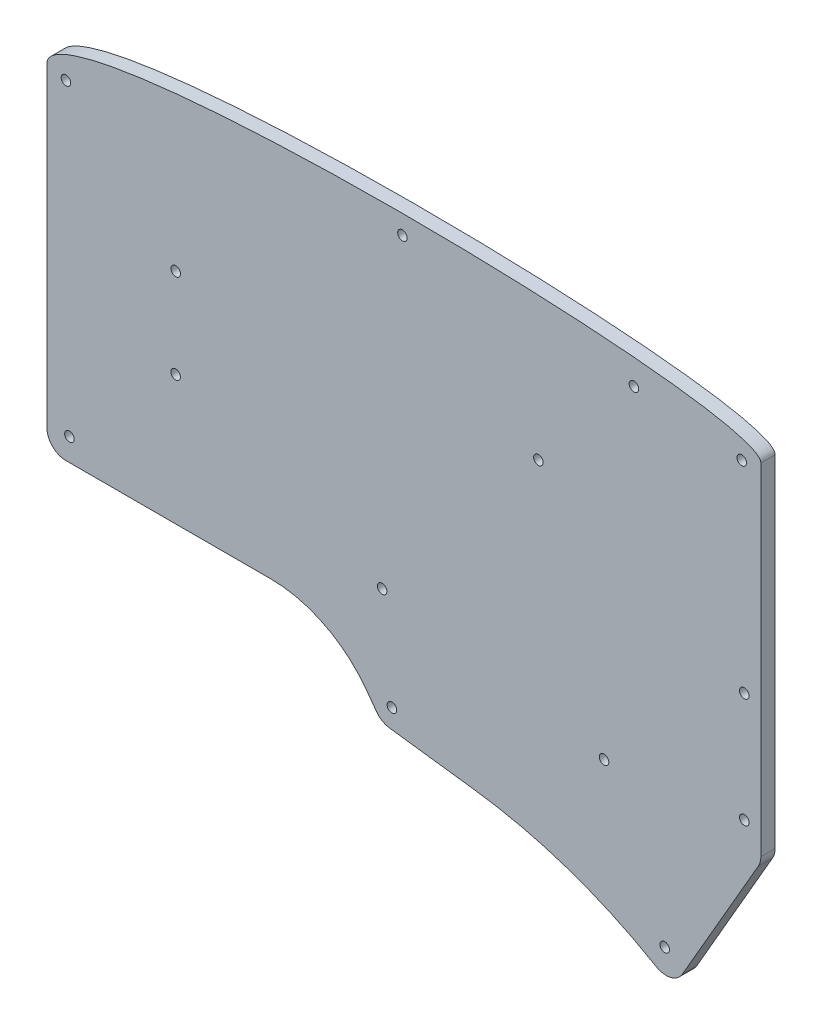
ISO-10303-21;
HEADER;
FILE_DESCRIPTION(('STEP AP214'),'2;1');
FILE_NAME('part.step','',(''),(''),'','','');
FILE_SCHEMA(('AUTOMOTIVE_DESIGN { 1 0 10303 214 1 1 1 1 }'));
ENDSEC;
DATA;
#1=APPLICATION_CONTEXT('core data for automotive mechanical design processes');
#2=APPLICATION_PROTOCOL_DEFINITION('international standard','automotive_design',2000,#1);
#3=PRODUCT_CONTEXT('',#1,'mechanical');
#4=PRODUCT('Part','Part','',(#3));
#5=PRODUCT_RELATED_PRODUCT_CATEGORY('part','',(#4));
#6=PRODUCT_DEFINITION_FORMATION('','',#4);
#7=PRODUCT_DEFINITION_CONTEXT('part definition',#1,'design');
#8=PRODUCT_DEFINITION('design','',#6,#7);
#9=PRODUCT_DEFINITION_SHAPE('','',#8);
#10=(LENGTH_UNIT() NAMED_UNIT(*) SI_UNIT(.MILLI.,.METRE.));
#11=(NAMED_UNIT(*) PLANE_ANGLE_UNIT() SI_UNIT($,.RADIAN.));
#12=(NAMED_UNIT(*) SI_UNIT($,.STERADIAN.) SOLID_ANGLE_UNIT());
#13=UNCERTAINTY_MEASURE_WITH_UNIT(LENGTH_MEASURE(1.E-05),#10,'distance_accuracy_value','');
#14=(GEOMETRIC_REPRESENTATION_CONTEXT(3) GLOBAL_UNCERTAINTY_ASSIGNED_CONTEXT((#13)) GLOBAL_UNIT_ASSIGNED_CONTEXT((#10,
#11,#12)) REPRESENTATION_CONTEXT('',''));
#15=CARTESIAN_POINT('',(0.,0.,0.));
#16=DIRECTION('',(0.,0.,1.));
#17=DIRECTION('',(1.,0.,0.));
#18=AXIS2_PLACEMENT_3D('',#15,#16,#17);
#19=CARTESIAN_POINT('',(-5.60340836480404,96.4255615904271,3.));
#20=CARTESIAN_POINT('',(-5.60340836480403,103.460733083272,3.));
#21=CARTESIAN_POINT('',(68.6271572793247,109.640132520942,3.));
#22=CARTESIAN_POINT('',(143.989385395709,103.45856741741,3.));
#23=CARTESIAN_POINT('',(143.989385395703,98.7904693493434,3.));
#24=B_SPLINE_CURVE_WITH_KNOTS('',3,(#19,#20,#21,#22,#23),.UNSPECIFIED.,.F.,.F.,(4,1,4),(0.,
0.499912398993814,1.),.UNSPECIFIED.);
#25=DIRECTION('',(0.,0.,-1.));
#26=VECTOR('',#25,1.);
#27=SURFACE_OF_LINEAR_EXTRUSION('',#24,#26);
#28=CARTESIAN_POINT('',(-5.60340836480404,96.4255615904271,0.));
#29=CARTESIAN_POINT('',(-5.60340836480403,103.460733083272,0.));
#30=CARTESIAN_POINT('',(68.6271572793247,109.640132520942,0.));
#31=CARTESIAN_POINT('',(143.989385395709,103.45856741741,0.));
#32=CARTESIAN_POINT('',(143.989385395703,98.7904693493434,0.));
#33=B_SPLINE_CURVE_WITH_KNOTS('',3,(#28,#29,#30,#31,#32),.UNSPECIFIED.,.F.,.F.,(4,1,4),(0.,
0.499912398993814,1.),.UNSPECIFIED.);
#34=CARTESIAN_POINT('',(-5.60340836480404,96.4255615904271,0.));
#35=VERTEX_POINT('',#34);
#36=CARTESIAN_POINT('',(143.989385395703,98.7904693493434,0.));
#37=VERTEX_POINT('',#36);
#38=EDGE_CURVE('E208',#35,#37,#33,.T.);
#39=ORIENTED_EDGE('',*,*,#38,.F.);
#40=DIRECTION('',(0.,0.,-1.));
#41=VECTOR('',#40,1.);
#42=CARTESIAN_POINT('',(-5.60340836480404,96.4255615904271,3.));
#43=LINE('',#42,#41);
#44=CARTESIAN_POINT('',(-5.60340836480404,96.4255615904271,3.));
#45=VERTEX_POINT('',#44);
#46=EDGE_CURVE('E11',#45,#35,#43,.T.);
#47=ORIENTED_EDGE('',*,*,#46,.F.);
#48=CARTESIAN_POINT('',(143.989385395703,98.7904693493434,3.));
#49=VERTEX_POINT('',#48);
#50=EDGE_CURVE('E293',#45,#49,#24,.T.);
#51=ORIENTED_EDGE('',*,*,#50,.T.);
#52=DIRECTION('',(0.,0.,-1.));
#53=VECTOR('',#52,1.);
#54=CARTESIAN_POINT('',(143.989385395703,98.7904693493434,3.));
#55=LINE('',#54,#53);
#56=EDGE_CURVE('E104',#49,#37,#55,.T.);
#57=ORIENTED_EDGE('',*,*,#56,.T.);
#58=EDGE_LOOP('',(#39,#47,#51,#57));
#59=FACE_BOUND('',#58,.T.);
#60=ADVANCED_FACE('F35',(#59),#27,.T.);
#61=CARTESIAN_POINT('',(-5.60340836480404,0.,3.));
#62=DIRECTION('',(1.,0.,0.));
#63=DIRECTION('',(0.,1.,0.));
#64=AXIS2_PLACEMENT_3D('',#61,#62,#63);
#65=PLANE('',#64);
#66=DIRECTION('',(0.,-1.,0.));
#67=VECTOR('',#66,1.);
#68=CARTESIAN_POINT('',(-5.60340836480404,0.,0.));
#69=LINE('',#68,#67);
#70=CARTESIAN_POINT('',(-5.60340836480404,30.4255688575379,0.));
#71=VERTEX_POINT('',#70);
#72=EDGE_CURVE('E213',#35,#71,#69,.T.);
#73=ORIENTED_EDGE('',*,*,#72,.T.);
#74=DIRECTION('',(0.,0.,-1.));
#75=VECTOR('',#74,1.);
#76=CARTESIAN_POINT('',(-5.60340836480404,30.4255688575379,3.));
#77=LINE('',#76,#75);
#78=CARTESIAN_POINT('',(-5.60340836480404,30.4255688575379,3.));
#79=VERTEX_POINT('',#78);
#80=EDGE_CURVE('E44',#79,#71,#77,.T.);
#81=ORIENTED_EDGE('',*,*,#80,.F.);
#82=DIRECTION('',(0.,-1.,0.));
#83=VECTOR('',#82,1.);
#84=CARTESIAN_POINT('',(-5.60340836480404,0.,3.));
#85=LINE('',#84,#83);
#86=EDGE_CURVE('E337',#45,#79,#85,.T.);
#87=ORIENTED_EDGE('',*,*,#86,.F.);
#88=ORIENTED_EDGE('',*,*,#46,.T.);
#89=EDGE_LOOP('',(#73,#81,#87,#88));
#90=FACE_BOUND('',#89,.T.);
#91=ADVANCED_FACE('F321',(#90),#65,.F.);
#92=CARTESIAN_POINT('',(-1.60340836480404,30.4255688575379,3.));
#93=DIRECTION('',(0.,0.,-1.));
#94=DIRECTION('',(-1.,0.,0.));
#95=AXIS2_PLACEMENT_3D('',#92,#93,#94);
#96=CYLINDRICAL_SURFACE('',#95,4.);
#97=CARTESIAN_POINT('',(-1.60340836480404,30.4255688575379,0.));
#98=DIRECTION('',(0.,0.,1.));
#99=DIRECTION('',(1.,0.,0.));
#100=AXIS2_PLACEMENT_3D('',#97,#98,#99);
#101=CIRCLE('',#100,4.);
#102=CARTESIAN_POINT('',(-1.60340836480401,26.4255688575379,0.));
#103=VERTEX_POINT('',#102);
#104=EDGE_CURVE('E219',#103,#71,#101,.F.);
#105=ORIENTED_EDGE('',*,*,#104,.F.);
#106=DIRECTION('',(0.,0.,-1.));
#107=VECTOR('',#106,1.);
#108=CARTESIAN_POINT('',(-1.60340836480401,26.4255688575379,3.));
#109=LINE('',#108,#107);
#110=CARTESIAN_POINT('',(-1.60340836480401,26.4255688575379,3.));
#111=VERTEX_POINT('',#110);
#112=EDGE_CURVE('E311',#111,#103,#109,.T.);
#113=ORIENTED_EDGE('',*,*,#112,.F.);
#114=CARTESIAN_POINT('',(-1.60340836480404,30.4255688575379,3.));
#115=DIRECTION('',(0.,0.,1.));
#116=DIRECTION('',(1.,0.,0.));
#117=AXIS2_PLACEMENT_3D('',#114,#115,#116);
#118=CIRCLE('',#117,4.);
#119=EDGE_CURVE('E318',#111,#79,#118,.F.);
#120=ORIENTED_EDGE('',*,*,#119,.T.);
#121=ORIENTED_EDGE('',*,*,#80,.T.);
#122=EDGE_LOOP('',(#105,#113,#120,#121));
#123=FACE_BOUND('',#122,.T.);
#124=ADVANCED_FACE('F316',(#123),#96,.T.);
#125=CARTESIAN_POINT('',(0.,26.4255688575379,3.));
#126=DIRECTION('',(0.,1.,0.));
#127=DIRECTION('',(0.,0.,1.));
#128=AXIS2_PLACEMENT_3D('',#125,#126,#127);
#129=PLANE('',#128);
#130=DIRECTION('',(1.,0.,0.));
#131=VECTOR('',#130,1.);
#132=CARTESIAN_POINT('',(0.,26.4255688575379,0.));
#133=LINE('',#132,#131);
#134=CARTESIAN_POINT('',(41.2672141804128,26.4255688575379,0.));
#135=VERTEX_POINT('',#134);
#136=EDGE_CURVE('E222',#103,#135,#133,.T.);
#137=ORIENTED_EDGE('',*,*,#136,.T.);
#138=DIRECTION('',(0.,0.,-1.));
#139=VECTOR('',#138,1.);
#140=CARTESIAN_POINT('',(41.2672141804128,26.4255688575379,3.));
#141=LINE('',#140,#139);
#142=CARTESIAN_POINT('',(41.2672141804128,26.4255688575379,3.));
#143=VERTEX_POINT('',#142);
#144=EDGE_CURVE('E309',#143,#135,#141,.T.);
#145=ORIENTED_EDGE('',*,*,#144,.F.);
#146=DIRECTION('',(1.,0.,0.));
#147=VECTOR('',#146,1.);
#148=CARTESIAN_POINT('',(0.,26.4255688575379,3.));
#149=LINE('',#148,#147);
#150=EDGE_CURVE('E333',#111,#143,#149,.T.);
#151=ORIENTED_EDGE('',*,*,#150,.F.);
#152=ORIENTED_EDGE('',*,*,#112,.T.);
#153=EDGE_LOOP('',(#137,#145,#151,#152));
#154=FACE_BOUND('',#153,.T.);
#155=ADVANCED_FACE('F330',(#154),#129,.F.);
#156=CARTESIAN_POINT('',(41.2672141804129,1.42556885753786,3.));
#157=DIRECTION('',(0.,0.,-1.));
#158=DIRECTION('',(-1.,0.,0.));
#159=AXIS2_PLACEMENT_3D('',#156,#157,#158);
#160=CYLINDRICAL_SURFACE('',#159,25.);
#161=CARTESIAN_POINT('',(41.2672141804129,1.42556885753786,0.));
#162=DIRECTION('',(0.,0.,1.));
#163=DIRECTION('',(1.,0.,0.));
#164=AXIS2_PLACEMENT_3D('',#161,#162,#163);
#165=CIRCLE('',#164,25.);
#166=CARTESIAN_POINT('',(61.4664169198252,16.156224263599,0.));
#167=VERTEX_POINT('',#166);
#168=EDGE_CURVE('E225',#167,#135,#165,.T.);
#169=ORIENTED_EDGE('',*,*,#168,.F.);
#170=DIRECTION('',(0.,0.,-1.));
#171=VECTOR('',#170,1.);
#172=CARTESIAN_POINT('',(61.4664169198252,16.156224263599,3.));
#173=LINE('',#172,#171);
#174=CARTESIAN_POINT('',(61.4664169198252,16.156224263599,3.));
#175=VERTEX_POINT('',#174);
#176=EDGE_CURVE('E307',#175,#167,#173,.T.);
#177=ORIENTED_EDGE('',*,*,#176,.F.);
#178=CARTESIAN_POINT('',(41.2672141804129,1.42556885753786,3.));
#179=DIRECTION('',(0.,0.,1.));
#180=DIRECTION('',(1.,0.,0.));
#181=AXIS2_PLACEMENT_3D('',#178,#179,#180);
#182=CIRCLE('',#181,25.);
#183=EDGE_CURVE('E335',#175,#143,#182,.T.);
#184=ORIENTED_EDGE('',*,*,#183,.T.);
#185=ORIENTED_EDGE('',*,*,#144,.T.);
#186=EDGE_LOOP('',(#169,#177,#184,#185));
#187=FACE_BOUND('',#186,.T.);
#188=ADVANCED_FACE('F376',(#187),#160,.F.);
#189=CARTESIAN_POINT('',(47.8176337053878,34.871925072218,3.));
#190=DIRECTION('',(0.807968109576491,0.589226216242448,0.));
#191=DIRECTION('',(-0.589226216242448,0.807968109576491,0.));
#192=AXIS2_PLACEMENT_3D('',#189,#190,#191);
#193=PLANE('',#192);
#194=DIRECTION('',(0.589226216242448,-0.807968109576491,0.));
#195=VECTOR('',#194,1.);
#196=CARTESIAN_POINT('',(47.8176337053878,34.871925072218,0.));
#197=LINE('',#196,#195);
#198=CARTESIAN_POINT('',(63.4651141754063,13.4155389398775,0.));
#199=VERTEX_POINT('',#198);
#200=EDGE_CURVE('E228',#167,#199,#197,.T.);
#201=ORIENTED_EDGE('',*,*,#200,.T.);
#202=DIRECTION('',(0.,0.,-1.));
#203=VECTOR('',#202,1.);
#204=CARTESIAN_POINT('',(63.4651141754063,13.4155389398775,3.));
#205=LINE('',#204,#203);
#206=CARTESIAN_POINT('',(63.4651141754063,13.4155389398775,3.));
#207=VERTEX_POINT('',#206);
#208=EDGE_CURVE('E305',#207,#199,#205,.T.);
#209=ORIENTED_EDGE('',*,*,#208,.F.);
#210=DIRECTION('',(0.589226216242448,-0.807968109576491,0.));
#211=VECTOR('',#210,1.);
#212=CARTESIAN_POINT('',(47.8176337053878,34.871925072218,3.));
#213=LINE('',#212,#211);
#214=EDGE_CURVE('E342',#175,#207,#213,.T.);
#215=ORIENTED_EDGE('',*,*,#214,.F.);
#216=ORIENTED_EDGE('',*,*,#176,.T.);
#217=EDGE_LOOP('',(#201,#209,#215,#216));
#218=FACE_BOUND('',#217,.T.);
#219=ADVANCED_FACE('F379',(#218),#193,.F.);
#220=CARTESIAN_POINT('',(66.6969866137123,15.7724438048473,3.));
#221=DIRECTION('',(0.,0.,-1.));
#222=DIRECTION('',(-1.,0.,0.));
#223=AXIS2_PLACEMENT_3D('',#220,#221,#222);
#224=CYLINDRICAL_SURFACE('',#223,4.);
#225=CARTESIAN_POINT('',(66.6969866137123,15.7724438048473,0.));
#226=DIRECTION('',(0.,0.,1.));
#227=DIRECTION('',(1.,0.,0.));
#228=AXIS2_PLACEMENT_3D('',#225,#226,#227);
#229=CIRCLE('',#228,4.);
#230=CARTESIAN_POINT('',(66.1810041743476,11.8058631461102,0.));
#231=VERTEX_POINT('',#230);
#232=EDGE_CURVE('E231',#231,#199,#229,.F.);
#233=ORIENTED_EDGE('',*,*,#232,.F.);
#234=DIRECTION('',(0.,0.,-1.));
#235=VECTOR('',#234,1.);
#236=CARTESIAN_POINT('',(66.1810041743476,11.8058631461102,3.));
#237=LINE('',#236,#235);
#238=CARTESIAN_POINT('',(66.1810041743476,11.8058631461102,3.));
#239=VERTEX_POINT('',#238);
#240=EDGE_CURVE('E303',#239,#231,#237,.T.);
#241=ORIENTED_EDGE('',*,*,#240,.F.);
#242=CARTESIAN_POINT('',(66.6969866137123,15.7724438048473,3.));
#243=DIRECTION('',(0.,0.,1.));
#244=DIRECTION('',(1.,0.,0.));
#245=AXIS2_PLACEMENT_3D('',#242,#243,#244);
#246=CIRCLE('',#245,4.);
#247=EDGE_CURVE('E344',#239,#207,#246,.F.);
#248=ORIENTED_EDGE('',*,*,#247,.T.);
#249=ORIENTED_EDGE('',*,*,#208,.T.);
#250=EDGE_LOOP('',(#233,#241,#248,#249));
#251=FACE_BOUND('',#250,.T.);
#252=ADVANCED_FACE('F383',(#251),#224,.T.);
#253=CARTESIAN_POINT('',(2.61142403089936,20.07514842071,3.));
#254=DIRECTION('',(0.128995609841179,0.991645164684275,0.));
#255=DIRECTION('',(-0.991645164684275,0.128995609841179,0.));
#256=AXIS2_PLACEMENT_3D('',#253,#254,#255);
#257=PLANE('',#256);
#258=DIRECTION('',(0.991645164684275,-0.128995609841179,0.));
#259=VECTOR('',#258,1.);
#260=CARTESIAN_POINT('',(2.61142403089936,20.07514842071,0.));
#261=LINE('',#260,#259);
#262=CARTESIAN_POINT('',(84.1879397351147,9.46347726378552,0.));
#263=VERTEX_POINT('',#262);
#264=EDGE_CURVE('E234',#231,#263,#261,.T.);
#265=ORIENTED_EDGE('',*,*,#264,.T.);
#266=DIRECTION('',(0.,0.,-1.));
#267=VECTOR('',#266,1.);
#268=CARTESIAN_POINT('',(84.1879397351147,9.46347726378552,3.));
#269=LINE('',#268,#267);
#270=CARTESIAN_POINT('',(84.1879397351147,9.46347726378552,3.));
#271=VERTEX_POINT('',#270);
#272=EDGE_CURVE('E301',#271,#263,#269,.T.);
#273=ORIENTED_EDGE('',*,*,#272,.F.);
#274=DIRECTION('',(0.991645164684275,-0.128995609841179,0.));
#275=VECTOR('',#274,1.);
#276=CARTESIAN_POINT('',(2.61142403089936,20.07514842071,3.));
#277=LINE('',#276,#275);
#278=EDGE_CURVE('E347',#239,#271,#277,.T.);
#279=ORIENTED_EDGE('',*,*,#278,.F.);
#280=ORIENTED_EDGE('',*,*,#240,.T.);
#281=EDGE_LOOP('',(#265,#273,#279,#280));
#282=FACE_BOUND('',#281,.T.);
#283=ADVANCED_FACE('F387',(#282),#257,.F.);
#284=CARTESIAN_POINT('',(71.2883787509972,-89.701039204642,3.));
#285=DIRECTION('',(0.,0.,-1.));
#286=DIRECTION('',(-1.,0.,0.));
#287=AXIS2_PLACEMENT_3D('',#284,#285,#286);
#288=CYLINDRICAL_SURFACE('',#287,100.);
#289=CARTESIAN_POINT('',(71.2883787509972,-89.701039204642,0.));
#290=DIRECTION('',(0.,0.,1.));
#291=DIRECTION('',(1.,0.,0.));
#292=AXIS2_PLACEMENT_3D('',#289,#290,#291);
#293=CIRCLE('',#292,100.);
#294=CARTESIAN_POINT('',(121.325879514695,-3.12016073068008,0.));
#295=VERTEX_POINT('',#294);
#296=EDGE_CURVE('E237',#295,#263,#293,.T.);
#297=ORIENTED_EDGE('',*,*,#296,.F.);
#298=DIRECTION('',(0.,0.,-1.));
#299=VECTOR('',#298,1.);
#300=CARTESIAN_POINT('',(121.325879514695,-3.12016073068008,3.));
#301=LINE('',#300,#299);
#302=CARTESIAN_POINT('',(121.325879514695,-3.12016073068008,3.));
#303=VERTEX_POINT('',#302);
#304=EDGE_CURVE('E299',#303,#295,#301,.T.);
#305=ORIENTED_EDGE('',*,*,#304,.F.);
#306=CARTESIAN_POINT('',(71.2883787509972,-89.701039204642,3.));
#307=DIRECTION('',(0.,0.,1.));
#308=DIRECTION('',(1.,0.,0.));
#309=AXIS2_PLACEMENT_3D('',#306,#307,#308);
#310=CIRCLE('',#309,100.);
#311=EDGE_CURVE('E349',#303,#271,#310,.T.);
#312=ORIENTED_EDGE('',*,*,#311,.T.);
#313=ORIENTED_EDGE('',*,*,#272,.T.);
#314=EDGE_LOOP('',(#297,#305,#312,#313));
#315=FACE_BOUND('',#314,.T.);
#316=ADVANCED_FACE('F391',(#315),#288,.F.);
#317=CARTESIAN_POINT('',(29.0252407178952,50.2229488067635,3.));
#318=DIRECTION('',(0.500375007636977,0.865808784739619,0.));
#319=DIRECTION('',(-0.865808784739619,0.500375007636977,0.));
#320=AXIS2_PLACEMENT_3D('',#317,#318,#319);
#321=PLANE('',#320);
#322=DIRECTION('',(0.865808784739619,-0.500375007636977,0.));
#323=VECTOR('',#322,1.);
#324=CARTESIAN_POINT('',(29.0252407178952,50.2229488067635,0.));
#325=LINE('',#324,#323);
#326=CARTESIAN_POINT('',(122.126093986319,-3.58262695810535,0.));
#327=VERTEX_POINT('',#326);
#328=EDGE_CURVE('E240',#295,#327,#325,.T.);
#329=ORIENTED_EDGE('',*,*,#328,.T.);
#330=DIRECTION('',(0.,0.,-1.));
#331=VECTOR('',#330,1.);
#332=CARTESIAN_POINT('',(122.126093986319,-3.58262695810535,3.));
#333=LINE('',#332,#331);
#334=CARTESIAN_POINT('',(122.126093986319,-3.58262695810535,3.));
#335=VERTEX_POINT('',#334);
#336=EDGE_CURVE('E297',#335,#327,#333,.T.);
#337=ORIENTED_EDGE('',*,*,#336,.F.);
#338=DIRECTION('',(0.865808784739619,-0.500375007636977,0.));
#339=VECTOR('',#338,1.);
#340=CARTESIAN_POINT('',(29.0252407178952,50.2229488067635,3.));
#341=LINE('',#340,#339);
#342=EDGE_CURVE('E352',#303,#335,#341,.T.);
#343=ORIENTED_EDGE('',*,*,#342,.F.);
#344=ORIENTED_EDGE('',*,*,#304,.T.);
#345=EDGE_LOOP('',(#329,#337,#343,#344));
#346=FACE_BOUND('',#345,.T.);
#347=ADVANCED_FACE('F395',(#346),#321,.F.);
#348=CARTESIAN_POINT('',(124.127594016867,-0.119391819146861,3.));
#349=DIRECTION('',(0.,0.,-1.));
#350=DIRECTION('',(-1.,0.,0.));
#351=AXIS2_PLACEMENT_3D('',#348,#349,#350);
#352=CYLINDRICAL_SURFACE('',#351,3.99999999999999);
#353=CARTESIAN_POINT('',(124.127594016867,-0.119391819146861,0.));
#354=DIRECTION('',(0.,0.,1.));
#355=DIRECTION('',(1.,0.,0.));
#356=AXIS2_PLACEMENT_3D('',#353,#354,#355);
#357=CIRCLE('',#356,3.99999999999999);
#358=CARTESIAN_POINT('',(127.591695632005,-2.11939181914664,0.));
#359=VERTEX_POINT('',#358);
#360=EDGE_CURVE('E243',#359,#327,#357,.F.);
#361=ORIENTED_EDGE('',*,*,#360,.F.);
#362=DIRECTION('',(0.,0.,-1.));
#363=VECTOR('',#362,1.);
#364=CARTESIAN_POINT('',(127.591695632005,-2.11939181914664,3.));
#365=LINE('',#364,#363);
#366=CARTESIAN_POINT('',(127.591695632005,-2.11939181914664,3.));
#367=VERTEX_POINT('',#366);
#368=EDGE_CURVE('E159',#367,#359,#365,.T.);
#369=ORIENTED_EDGE('',*,*,#368,.F.);
#370=CARTESIAN_POINT('',(124.127594016867,-0.119391819146861,3.));
#371=DIRECTION('',(0.,0.,1.));
#372=DIRECTION('',(1.,0.,0.));
#373=AXIS2_PLACEMENT_3D('',#370,#371,#372);
#374=CIRCLE('',#373,3.99999999999999);
#375=EDGE_CURVE('E148',#367,#335,#374,.F.);
#376=ORIENTED_EDGE('',*,*,#375,.T.);
#377=ORIENTED_EDGE('',*,*,#336,.T.);
#378=EDGE_LOOP('',(#361,#369,#376,#377));
#379=FACE_BOUND('',#378,.T.);
#380=ADVANCED_FACE('F355',(#379),#352,.T.);
#381=CARTESIAN_POINT('',(96.6114953019872,-55.7786728194067,3.));
#382=DIRECTION('',(-0.866025403784469,0.499999999999947,0.));
#383=DIRECTION('',(-0.499999999999947,-0.86602540378447,0.));
#384=AXIS2_PLACEMENT_3D('',#381,#382,#383);
#385=PLANE('',#384);
#386=DIRECTION('',(0.499999999999947,0.866025403784469,0.));
#387=VECTOR('',#386,1.);
#388=CARTESIAN_POINT('',(96.6114953019872,-55.7786728194067,0.));
#389=LINE('',#388,#387);
#390=CARTESIAN_POINT('',(143.453487010841,25.35403674806,0.));
#391=VERTEX_POINT('',#390);
#392=EDGE_CURVE('E155',#359,#391,#389,.T.);
#393=ORIENTED_EDGE('',*,*,#392,.T.);
#394=DIRECTION('',(0.,0.,-1.));
#395=VECTOR('',#394,1.);
#396=CARTESIAN_POINT('',(143.453487010841,25.35403674806,3.));
#397=LINE('',#396,#395);
#398=CARTESIAN_POINT('',(143.453487010841,25.35403674806,3.));
#399=VERTEX_POINT('',#398);
#400=EDGE_CURVE('E152',#399,#391,#397,.T.);
#401=ORIENTED_EDGE('',*,*,#400,.F.);
#402=DIRECTION('',(0.499999999999947,0.866025403784469,0.));
#403=VECTOR('',#402,1.);
#404=CARTESIAN_POINT('',(96.6114953019872,-55.7786728194067,3.));
#405=LINE('',#404,#403);
#406=EDGE_CURVE('E141',#367,#399,#405,.T.);
#407=ORIENTED_EDGE('',*,*,#406,.F.);
#408=ORIENTED_EDGE('',*,*,#368,.T.);
#409=EDGE_LOOP('',(#393,#401,#407,#408));
#410=FACE_BOUND('',#409,.T.);
#411=ADVANCED_FACE('F153',(#410),#385,.F.);
#412=CARTESIAN_POINT('',(139.989385395703,27.3540367480598,3.));
#413=DIRECTION('',(0.,0.,-1.));
#414=DIRECTION('',(-1.,0.,0.));
#415=AXIS2_PLACEMENT_3D('',#412,#413,#414);
#416=CYLINDRICAL_SURFACE('',#415,4.);
#417=CARTESIAN_POINT('',(139.989385395703,27.3540367480598,0.));
#418=DIRECTION('',(0.,0.,1.));
#419=DIRECTION('',(1.,0.,0.));
#420=AXIS2_PLACEMENT_3D('',#417,#418,#419);
#421=CIRCLE('',#420,4.);
#422=CARTESIAN_POINT('',(143.989385395703,27.3540367480598,0.));
#423=VERTEX_POINT('',#422);
#424=EDGE_CURVE('E247',#423,#391,#421,.F.);
#425=ORIENTED_EDGE('',*,*,#424,.F.);
#426=DIRECTION('',(0.,0.,-1.));
#427=VECTOR('',#426,1.);
#428=CARTESIAN_POINT('',(143.989385395703,27.3540367480598,3.));
#429=LINE('',#428,#427);
#430=CARTESIAN_POINT('',(143.989385395703,27.3540367480598,3.));
#431=VERTEX_POINT('',#430);
#432=EDGE_CURVE('E97',#431,#423,#429,.T.);
#433=ORIENTED_EDGE('',*,*,#432,.F.);
#434=CARTESIAN_POINT('',(139.989385395703,27.3540367480598,3.));
#435=DIRECTION('',(0.,0.,1.));
#436=DIRECTION('',(1.,0.,0.));
#437=AXIS2_PLACEMENT_3D('',#434,#435,#436);
#438=CIRCLE('',#437,4.);
#439=EDGE_CURVE('E146',#431,#399,#438,.F.);
#440=ORIENTED_EDGE('',*,*,#439,.T.);
#441=ORIENTED_EDGE('',*,*,#400,.T.);
#442=EDGE_LOOP('',(#425,#433,#440,#441));
#443=FACE_BOUND('',#442,.T.);
#444=ADVANCED_FACE('F161',(#443),#416,.T.);
#445=CARTESIAN_POINT('',(21.3877982759689,53.5502350908751,3.));
#446=DIRECTION('',(0.,0.,-1.));
#447=DIRECTION('',(-1.,0.,0.));
#448=AXIS2_PLACEMENT_3D('',#445,#446,#447);
#449=CYLINDRICAL_SURFACE('',#448,1.);
#450=CARTESIAN_POINT('',(21.3877982759689,53.5502350908751,3.));
#451=DIRECTION('',(0.,0.,1.));
#452=DIRECTION('',(1.,0.,0.));
#453=AXIS2_PLACEMENT_3D('',#450,#451,#452);
#454=CIRCLE('',#453,1.);
#455=CARTESIAN_POINT('',(22.3877982759689,53.5502350908751,3.));
#456=VERTEX_POINT('',#455);
#457=EDGE_CURVE('E202',#456,#456,#454,.T.);
#458=ORIENTED_EDGE('',*,*,#457,.T.);
#459=EDGE_LOOP('',(#458));
#460=FACE_BOUND('',#459,.T.);
#461=CARTESIAN_POINT('',(21.3877982759689,53.5502350908751,0.));
#462=DIRECTION('',(0.,0.,1.));
#463=DIRECTION('',(1.,0.,0.));
#464=AXIS2_PLACEMENT_3D('',#461,#462,#463);
#465=CIRCLE('',#464,1.);
#466=CARTESIAN_POINT('',(22.3877982759689,53.5502350908751,0.));
#467=VERTEX_POINT('',#466);
#468=EDGE_CURVE('E287',#467,#467,#465,.T.);
#469=ORIENTED_EDGE('',*,*,#468,.F.);
#470=EDGE_LOOP('',(#469));
#471=FACE_BOUND('',#470,.T.);
#472=ADVANCED_FACE('F406',(#460,#471),#449,.F.);
#473=CARTESIAN_POINT('',(64.6378635328406,36.3000901732402,3.));
#474=DIRECTION('',(0.,0.,-1.));
#475=DIRECTION('',(-1.,0.,0.));
#476=AXIS2_PLACEMENT_3D('',#473,#474,#475);
#477=CYLINDRICAL_SURFACE('',#476,0.999999999999998);
#478=CARTESIAN_POINT('',(64.6378635328406,36.3000901732402,3.));
#479=DIRECTION('',(0.,0.,1.));
#480=DIRECTION('',(1.,0.,0.));
#481=AXIS2_PLACEMENT_3D('',#478,#479,#480);
#482=CIRCLE('',#481,0.999999999999998);
#483=CARTESIAN_POINT('',(65.6378635328406,36.3000901732402,3.));
#484=VERTEX_POINT('',#483);
#485=EDGE_CURVE('E199',#484,#484,#482,.T.);
#486=ORIENTED_EDGE('',*,*,#485,.T.);
#487=EDGE_LOOP('',(#486));
#488=FACE_BOUND('',#487,.T.);
#489=CARTESIAN_POINT('',(64.6378635328406,36.3000901732402,0.));
#490=DIRECTION('',(0.,0.,1.));
#491=DIRECTION('',(1.,0.,0.));
#492=AXIS2_PLACEMENT_3D('',#489,#490,#491);
#493=CIRCLE('',#492,0.999999999999998);
#494=CARTESIAN_POINT('',(65.6378635328406,36.3000901732402,0.));
#495=VERTEX_POINT('',#494);
#496=EDGE_CURVE('E284',#495,#495,#493,.T.);
#497=ORIENTED_EDGE('',*,*,#496,.F.);
#498=EDGE_LOOP('',(#497));
#499=FACE_BOUND('',#498,.T.);
#500=ADVANCED_FACE('F453',(#488,#499),#477,.F.);
#501=CARTESIAN_POINT('',(111.137845658361,28.5500518112157,3.));
#502=DIRECTION('',(0.,0.,-1.));
#503=DIRECTION('',(-1.,0.,0.));
#504=AXIS2_PLACEMENT_3D('',#501,#502,#503);
#505=CYLINDRICAL_SURFACE('',#504,0.999999999999998);
#506=CARTESIAN_POINT('',(111.137845658361,28.5500518112157,3.));
#507=DIRECTION('',(0.,0.,1.));
#508=DIRECTION('',(1.,0.,0.));
#509=AXIS2_PLACEMENT_3D('',#506,#507,#508);
#510=CIRCLE('',#509,0.999999999999998);
#511=CARTESIAN_POINT('',(112.137845658361,28.5500518112157,3.));
#512=VERTEX_POINT('',#511);
#513=EDGE_CURVE('E196',#512,#512,#510,.T.);
#514=ORIENTED_EDGE('',*,*,#513,.T.);
#515=EDGE_LOOP('',(#514));
#516=FACE_BOUND('',#515,.T.);
#517=CARTESIAN_POINT('',(111.137845658361,28.5500518112157,0.));
#518=DIRECTION('',(0.,0.,1.));
#519=DIRECTION('',(1.,0.,0.));
#520=AXIS2_PLACEMENT_3D('',#517,#518,#519);
#521=CIRCLE('',#520,0.999999999999998);
#522=CARTESIAN_POINT('',(112.137845658361,28.5500518112157,0.));
#523=VERTEX_POINT('',#522);
#524=EDGE_CURVE('E281',#523,#523,#521,.T.);
#525=ORIENTED_EDGE('',*,*,#524,.F.);
#526=EDGE_LOOP('',(#525));
#527=FACE_BOUND('',#526,.T.);
#528=ADVANCED_FACE('F449',(#516,#527),#505,.F.);
#529=CARTESIAN_POINT('',(97.3878272060292,76.0500388866752,3.));
#530=DIRECTION('',(0.,0.,-1.));
#531=DIRECTION('',(-1.,0.,0.));
#532=AXIS2_PLACEMENT_3D('',#529,#530,#531);
#533=CYLINDRICAL_SURFACE('',#532,0.999999999999998);
#534=CARTESIAN_POINT('',(97.3878272060292,76.0500388866752,3.));
#535=DIRECTION('',(0.,0.,1.));
#536=DIRECTION('',(1.,0.,0.));
#537=AXIS2_PLACEMENT_3D('',#534,#535,#536);
#538=CIRCLE('',#537,0.999999999999998);
#539=CARTESIAN_POINT('',(98.3878272060292,76.0500388866752,3.));
#540=VERTEX_POINT('',#539);
#541=EDGE_CURVE('E193',#540,#540,#538,.T.);
#542=ORIENTED_EDGE('',*,*,#541,.T.);
#543=EDGE_LOOP('',(#542));
#544=FACE_BOUND('',#543,.T.);
#545=CARTESIAN_POINT('',(97.3878272060292,76.0500388866752,0.));
#546=DIRECTION('',(0.,0.,1.));
#547=DIRECTION('',(1.,0.,0.));
#548=AXIS2_PLACEMENT_3D('',#545,#546,#547);
#549=CIRCLE('',#548,0.999999999999998);
#550=CARTESIAN_POINT('',(98.3878272060292,76.0500388866752,0.));
#551=VERTEX_POINT('',#550);
#552=EDGE_CURVE('E278',#551,#551,#549,.T.);
#553=ORIENTED_EDGE('',*,*,#552,.F.);
#554=EDGE_LOOP('',(#553));
#555=FACE_BOUND('',#554,.T.);
#556=ADVANCED_FACE('F445',(#544,#555),#533,.F.);
#557=CARTESIAN_POINT('',(140.524945013007,32.2810664530872,3.));
#558=DIRECTION('',(0.,0.,-1.));
#559=DIRECTION('',(-1.,0.,0.));
#560=AXIS2_PLACEMENT_3D('',#557,#558,#559);
#561=CYLINDRICAL_SURFACE('',#560,0.999999999999998);
#562=CARTESIAN_POINT('',(140.524945013007,32.2810664530872,3.));
#563=DIRECTION('',(0.,0.,1.));
#564=DIRECTION('',(1.,0.,0.));
#565=AXIS2_PLACEMENT_3D('',#562,#563,#564);
#566=CIRCLE('',#565,0.999999999999998);
#567=CARTESIAN_POINT('',(141.524945013007,32.2810664530872,3.));
#568=VERTEX_POINT('',#567);
#569=EDGE_CURVE('E190',#568,#568,#566,.T.);
#570=ORIENTED_EDGE('',*,*,#569,.T.);
#571=EDGE_LOOP('',(#570));
#572=FACE_BOUND('',#571,.T.);
#573=CARTESIAN_POINT('',(140.524945013007,32.2810664530872,0.));
#574=DIRECTION('',(0.,0.,1.));
#575=DIRECTION('',(1.,0.,0.));
#576=AXIS2_PLACEMENT_3D('',#573,#574,#575);
#577=CIRCLE('',#576,0.999999999999998);
#578=CARTESIAN_POINT('',(141.524945013007,32.2810664530872,0.));
#579=VERTEX_POINT('',#578);
#580=EDGE_CURVE('E275',#579,#579,#577,.T.);
#581=ORIENTED_EDGE('',*,*,#580,.F.);
#582=EDGE_LOOP('',(#581));
#583=FACE_BOUND('',#582,.T.);
#584=ADVANCED_FACE('F441',(#572,#583),#561,.F.);
#585=CARTESIAN_POINT('',(123.859596668122,0.881654910350953,3.));
#586=DIRECTION('',(0.,0.,-1.));
#587=DIRECTION('',(-1.,0.,0.));
#588=AXIS2_PLACEMENT_3D('',#585,#586,#587);
#589=CYLINDRICAL_SURFACE('',#588,0.999999999999998);
#590=CARTESIAN_POINT('',(123.859596668122,0.881654910350953,3.));
#591=DIRECTION('',(0.,0.,1.));
#592=DIRECTION('',(1.,0.,0.));
#593=AXIS2_PLACEMENT_3D('',#590,#591,#592);
#594=CIRCLE('',#593,0.999999999999998);
#595=CARTESIAN_POINT('',(124.859596668122,0.881654910350953,3.));
#596=VERTEX_POINT('',#595);
#597=EDGE_CURVE('E187',#596,#596,#594,.T.);
#598=ORIENTED_EDGE('',*,*,#597,.T.);
#599=EDGE_LOOP('',(#598));
#600=FACE_BOUND('',#599,.T.);
#601=CARTESIAN_POINT('',(123.859596668122,0.881654910350953,0.));
#602=DIRECTION('',(0.,0.,1.));
#603=DIRECTION('',(1.,0.,0.));
#604=AXIS2_PLACEMENT_3D('',#601,#602,#603);
#605=CIRCLE('',#604,0.999999999999998);
#606=CARTESIAN_POINT('',(124.859596668122,0.881654910350953,0.));
#607=VERTEX_POINT('',#606);
#608=EDGE_CURVE('E272',#607,#607,#605,.T.);
#609=ORIENTED_EDGE('',*,*,#608,.F.);
#610=EDGE_LOOP('',(#609));
#611=FACE_BOUND('',#610,.T.);
#612=ADVANCED_FACE('F437',(#600,#611),#589,.F.);
#613=CARTESIAN_POINT('',(66.6969866137123,15.7724438048473,3.));
#614=DIRECTION('',(0.,0.,-1.));
#615=DIRECTION('',(-1.,0.,0.));
#616=AXIS2_PLACEMENT_3D('',#613,#614,#615);
#617=CYLINDRICAL_SURFACE('',#616,0.999999999999998);
#618=CARTESIAN_POINT('',(66.6969866137123,15.7724438048473,3.));
#619=DIRECTION('',(0.,0.,1.));
#620=DIRECTION('',(1.,0.,0.));
#621=AXIS2_PLACEMENT_3D('',#618,#619,#620);
#622=CIRCLE('',#621,0.999999999999998);
#623=CARTESIAN_POINT('',(67.6969866137123,15.7724438048473,3.));
#624=VERTEX_POINT('',#623);
#625=EDGE_CURVE('E184',#624,#624,#622,.T.);
#626=ORIENTED_EDGE('',*,*,#625,.T.);
#627=EDGE_LOOP('',(#626));
#628=FACE_BOUND('',#627,.T.);
#629=CARTESIAN_POINT('',(66.6969866137123,15.7724438048473,0.));
#630=DIRECTION('',(0.,0.,1.));
#631=DIRECTION('',(1.,0.,0.));
#632=AXIS2_PLACEMENT_3D('',#629,#630,#631);
#633=CIRCLE('',#632,0.999999999999998);
#634=CARTESIAN_POINT('',(67.6969866137123,15.7724438048473,0.));
#635=VERTEX_POINT('',#634);
#636=EDGE_CURVE('E269',#635,#635,#633,.T.);
#637=ORIENTED_EDGE('',*,*,#636,.F.);
#638=EDGE_LOOP('',(#637));
#639=FACE_BOUND('',#638,.T.);
#640=ADVANCED_FACE('F433',(#628,#639),#617,.F.);
#641=CARTESIAN_POINT('',(-0.871175317770399,31.1578019045715,3.));
#642=DIRECTION('',(0.,0.,-1.));
#643=DIRECTION('',(-1.,0.,0.));
#644=AXIS2_PLACEMENT_3D('',#641,#642,#643);
#645=CYLINDRICAL_SURFACE('',#644,1.);
#646=CARTESIAN_POINT('',(-0.871175317770399,31.1578019045715,3.));
#647=DIRECTION('',(0.,0.,1.));
#648=DIRECTION('',(1.,0.,0.));
#649=AXIS2_PLACEMENT_3D('',#646,#647,#648);
#650=CIRCLE('',#649,1.);
#651=CARTESIAN_POINT('',(0.128824682229601,31.1578019045715,3.));
#652=VERTEX_POINT('',#651);
#653=EDGE_CURVE('E181',#652,#652,#650,.T.);
#654=ORIENTED_EDGE('',*,*,#653,.T.);
#655=EDGE_LOOP('',(#654));
#656=FACE_BOUND('',#655,.T.);
#657=CARTESIAN_POINT('',(-0.871175317770399,31.1578019045715,0.));
#658=DIRECTION('',(0.,0.,1.));
#659=DIRECTION('',(1.,0.,0.));
#660=AXIS2_PLACEMENT_3D('',#657,#658,#659);
#661=CIRCLE('',#660,1.);
#662=CARTESIAN_POINT('',(0.128824682229601,31.1578019045715,0.));
#663=VERTEX_POINT('',#662);
#664=EDGE_CURVE('E266',#663,#663,#661,.T.);
#665=ORIENTED_EDGE('',*,*,#664,.F.);
#666=EDGE_LOOP('',(#665));
#667=FACE_BOUND('',#666,.T.);
#668=ADVANCED_FACE('F429',(#656,#667),#645,.F.);
#669=CARTESIAN_POINT('',(-1.60340836480404,95.4255615904271,3.));
#670=DIRECTION('',(0.,0.,-1.));
#671=DIRECTION('',(-1.,0.,0.));
#672=AXIS2_PLACEMENT_3D('',#669,#670,#671);
#673=CYLINDRICAL_SURFACE('',#672,1.);
#674=CARTESIAN_POINT('',(-1.60340836480404,95.4255615904271,3.));
#675=DIRECTION('',(0.,0.,1.));
#676=DIRECTION('',(1.,0.,0.));
#677=AXIS2_PLACEMENT_3D('',#674,#675,#676);
#678=CIRCLE('',#677,1.);
#679=CARTESIAN_POINT('',(-0.603408364804036,95.4255615904271,3.));
#680=VERTEX_POINT('',#679);
#681=EDGE_CURVE('E178',#680,#680,#678,.T.);
#682=ORIENTED_EDGE('',*,*,#681,.T.);
#683=EDGE_LOOP('',(#682));
#684=FACE_BOUND('',#683,.T.);
#685=CARTESIAN_POINT('',(-1.60340836480404,95.4255615904271,0.));
#686=DIRECTION('',(0.,0.,1.));
#687=DIRECTION('',(1.,0.,0.));
#688=AXIS2_PLACEMENT_3D('',#685,#686,#687);
#689=CIRCLE('',#688,1.);
#690=CARTESIAN_POINT('',(-0.603408364804036,95.4255615904271,0.));
#691=VERTEX_POINT('',#690);
#692=EDGE_CURVE('E263',#691,#691,#689,.T.);
#693=ORIENTED_EDGE('',*,*,#692,.F.);
#694=EDGE_LOOP('',(#693));
#695=FACE_BOUND('',#694,.T.);
#696=ADVANCED_FACE('F425',(#684,#695),#673,.F.);
#697=CARTESIAN_POINT('',(68.8969684268213,102.549891480499,3.));
#698=DIRECTION('',(0.,0.,-1.));
#699=DIRECTION('',(-1.,0.,0.));
#700=AXIS2_PLACEMENT_3D('',#697,#698,#699);
#701=CYLINDRICAL_SURFACE('',#700,0.999999999999998);
#702=CARTESIAN_POINT('',(68.8969684268213,102.549891480499,3.));
#703=DIRECTION('',(0.,0.,1.));
#704=DIRECTION('',(1.,0.,0.));
#705=AXIS2_PLACEMENT_3D('',#702,#703,#704);
#706=CIRCLE('',#705,0.999999999999998);
#707=CARTESIAN_POINT('',(69.8969684268213,102.549891480499,3.));
#708=VERTEX_POINT('',#707);
#709=EDGE_CURVE('E175',#708,#708,#706,.T.);
#710=ORIENTED_EDGE('',*,*,#709,.T.);
#711=EDGE_LOOP('',(#710));
#712=FACE_BOUND('',#711,.T.);
#713=CARTESIAN_POINT('',(68.8969684268213,102.549891480499,0.));
#714=DIRECTION('',(0.,0.,1.));
#715=DIRECTION('',(1.,0.,0.));
#716=AXIS2_PLACEMENT_3D('',#713,#714,#715);
#717=CIRCLE('',#716,0.999999999999998);
#718=CARTESIAN_POINT('',(69.8969684268213,102.549891480499,0.));
#719=VERTEX_POINT('',#718);
#720=EDGE_CURVE('E260',#719,#719,#717,.T.);
#721=ORIENTED_EDGE('',*,*,#720,.F.);
#722=EDGE_LOOP('',(#721));
#723=FACE_BOUND('',#722,.T.);
#724=ADVANCED_FACE('F421',(#712,#723),#701,.F.);
#725=CARTESIAN_POINT('',(117.399952062791,99.3904693493434,3.));
#726=DIRECTION('',(0.,0.,-1.));
#727=DIRECTION('',(-1.,0.,0.));
#728=AXIS2_PLACEMENT_3D('',#725,#726,#727);
#729=CYLINDRICAL_SURFACE('',#728,0.999999999999998);
#730=CARTESIAN_POINT('',(117.399952062791,99.3904693493434,3.));
#731=DIRECTION('',(0.,0.,1.));
#732=DIRECTION('',(1.,0.,0.));
#733=AXIS2_PLACEMENT_3D('',#730,#731,#732);
#734=CIRCLE('',#733,0.999999999999998);
#735=CARTESIAN_POINT('',(118.399952062791,99.3904693493434,3.));
#736=VERTEX_POINT('',#735);
#737=EDGE_CURVE('E172',#736,#736,#734,.T.);
#738=ORIENTED_EDGE('',*,*,#737,.T.);
#739=EDGE_LOOP('',(#738));
#740=FACE_BOUND('',#739,.T.);
#741=CARTESIAN_POINT('',(117.399952062791,99.3904693493434,0.));
#742=DIRECTION('',(0.,0.,1.));
#743=DIRECTION('',(1.,0.,0.));
#744=AXIS2_PLACEMENT_3D('',#741,#742,#743);
#745=CIRCLE('',#744,0.999999999999998);
#746=CARTESIAN_POINT('',(118.399952062791,99.3904693493434,0.));
#747=VERTEX_POINT('',#746);
#748=EDGE_CURVE('E257',#747,#747,#745,.T.);
#749=ORIENTED_EDGE('',*,*,#748,.F.);
#750=EDGE_LOOP('',(#749));
#751=FACE_BOUND('',#750,.T.);
#752=ADVANCED_FACE('F417',(#740,#751),#729,.F.);
#753=CARTESIAN_POINT('',(139.989385395703,97.2904693493434,3.));
#754=DIRECTION('',(0.,0.,-1.));
#755=DIRECTION('',(-1.,0.,0.));
#756=AXIS2_PLACEMENT_3D('',#753,#754,#755);
#757=CYLINDRICAL_SURFACE('',#756,0.999999999999998);
#758=CARTESIAN_POINT('',(139.989385395703,97.2904693493434,3.));
#759=DIRECTION('',(0.,0.,1.));
#760=DIRECTION('',(1.,0.,0.));
#761=AXIS2_PLACEMENT_3D('',#758,#759,#760);
#762=CIRCLE('',#761,0.999999999999998);
#763=CARTESIAN_POINT('',(140.989385395703,97.2904693493434,3.));
#764=VERTEX_POINT('',#763);
#765=EDGE_CURVE('E169',#764,#764,#762,.T.);
#766=ORIENTED_EDGE('',*,*,#765,.T.);
#767=EDGE_LOOP('',(#766));
#768=FACE_BOUND('',#767,.T.);
#769=CARTESIAN_POINT('',(139.989385395703,97.2904693493434,0.));
#770=DIRECTION('',(0.,0.,1.));
#771=DIRECTION('',(1.,0.,0.));
#772=AXIS2_PLACEMENT_3D('',#769,#770,#771);
#773=CIRCLE('',#772,0.999999999999998);
#774=CARTESIAN_POINT('',(140.989385395703,97.2904693493434,0.));
#775=VERTEX_POINT('',#774);
#776=EDGE_CURVE('E254',#775,#775,#773,.T.);
#777=ORIENTED_EDGE('',*,*,#776,.F.);
#778=EDGE_LOOP('',(#777));
#779=FACE_BOUND('',#778,.T.);
#780=ADVANCED_FACE('F413',(#768,#779),#757,.F.);
#781=CARTESIAN_POINT('',(140.524945013007,55.2810664530872,3.));
#782=DIRECTION('',(0.,0.,-1.));
#783=DIRECTION('',(-1.,0.,0.));
#784=AXIS2_PLACEMENT_3D('',#781,#782,#783);
#785=CYLINDRICAL_SURFACE('',#784,0.999999999999998);
#786=CARTESIAN_POINT('',(140.524945013007,55.2810664530872,3.));
#787=DIRECTION('',(0.,0.,1.));
#788=DIRECTION('',(1.,0.,0.));
#789=AXIS2_PLACEMENT_3D('',#786,#787,#788);
#790=CIRCLE('',#789,0.999999999999998);
#791=CARTESIAN_POINT('',(141.524945013007,55.2810664530872,3.));
#792=VERTEX_POINT('',#791);
#793=EDGE_CURVE('E163',#792,#792,#790,.T.);
#794=ORIENTED_EDGE('',*,*,#793,.T.);
#795=EDGE_LOOP('',(#794));
#796=FACE_BOUND('',#795,.T.);
#797=CARTESIAN_POINT('',(140.524945013007,55.2810664530872,0.));
#798=DIRECTION('',(0.,0.,1.));
#799=DIRECTION('',(1.,0.,0.));
#800=AXIS2_PLACEMENT_3D('',#797,#798,#799);
#801=CIRCLE('',#800,0.999999999999998);
#802=CARTESIAN_POINT('',(141.524945013007,55.2810664530872,0.));
#803=VERTEX_POINT('',#802);
#804=EDGE_CURVE('E251',#803,#803,#801,.T.);
#805=ORIENTED_EDGE('',*,*,#804,.F.);
#806=EDGE_LOOP('',(#805));
#807=FACE_BOUND('',#806,.T.);
#808=ADVANCED_FACE('F410',(#796,#807),#785,.F.);
#809=CARTESIAN_POINT('',(143.989385395703,2.23779834948061E-13,3.));
#810=DIRECTION('',(-1.,0.,0.));
#811=DIRECTION('',(0.,-1.,0.));
#812=AXIS2_PLACEMENT_3D('',#809,#810,#811);
#813=PLANE('',#812);
#814=DIRECTION('',(0.,1.,0.));
#815=VECTOR('',#814,1.);
#816=CARTESIAN_POINT('',(143.989385395703,2.23779834948061E-13,0.));
#817=LINE('',#816,#815);
#818=EDGE_CURVE('E249',#423,#37,#817,.T.);
#819=ORIENTED_EDGE('',*,*,#818,.T.);
#820=ORIENTED_EDGE('',*,*,#56,.F.);
#821=DIRECTION('',(0.,1.,0.));
#822=VECTOR('',#821,1.);
#823=CARTESIAN_POINT('',(143.989385395703,2.23779834948061E-13,3.));
#824=LINE('',#823,#822);
#825=EDGE_CURVE('E52',#431,#49,#824,.T.);
#826=ORIENTED_EDGE('',*,*,#825,.F.);
#827=ORIENTED_EDGE('',*,*,#432,.T.);
#828=EDGE_LOOP('',(#819,#820,#826,#827));
#829=FACE_BOUND('',#828,.T.);
#830=ADVANCED_FACE('F358',(#829),#813,.F.);
#831=CARTESIAN_POINT('',(21.3877982759683,72.3002410977241,3.));
#832=DIRECTION('',(0.,0.,-1.));
#833=DIRECTION('',(-1.,0.,0.));
#834=AXIS2_PLACEMENT_3D('',#831,#832,#833);
#835=CYLINDRICAL_SURFACE('',#834,1.);
#836=CARTESIAN_POINT('',(21.3877982759683,72.3002410977241,3.));
#837=DIRECTION('',(0.,0.,1.));
#838=DIRECTION('',(1.,0.,0.));
#839=AXIS2_PLACEMENT_3D('',#836,#837,#838);
#840=CIRCLE('',#839,1.);
#841=CARTESIAN_POINT('',(22.3877982759683,72.3002410977241,3.));
#842=VERTEX_POINT('',#841);
#843=EDGE_CURVE('E205',#842,#842,#840,.T.);
#844=ORIENTED_EDGE('',*,*,#843,.T.);
#845=EDGE_LOOP('',(#844));
#846=FACE_BOUND('',#845,.T.);
#847=CARTESIAN_POINT('',(21.3877982759683,72.3002410977241,0.));
#848=DIRECTION('',(0.,0.,1.));
#849=DIRECTION('',(1.,0.,0.));
#850=AXIS2_PLACEMENT_3D('',#847,#848,#849);
#851=CIRCLE('',#850,1.);
#852=CARTESIAN_POINT('',(22.3877982759683,72.3002410977241,0.));
#853=VERTEX_POINT('',#852);
#854=EDGE_CURVE('E290',#853,#853,#851,.T.);
#855=ORIENTED_EDGE('',*,*,#854,.F.);
#856=EDGE_LOOP('',(#855));
#857=FACE_BOUND('',#856,.T.);
#858=ADVANCED_FACE('F409',(#846,#857),#835,.F.);
#859=CARTESIAN_POINT('',(0.,0.,3.));
#860=DIRECTION('',(0.,0.,1.));
#861=DIRECTION('',(1.,0.,0.));
#862=AXIS2_PLACEMENT_3D('',#859,#860,#861);
#863=PLANE('',#862);
#864=ORIENTED_EDGE('',*,*,#50,.F.);
#865=ORIENTED_EDGE('',*,*,#86,.T.);
#866=ORIENTED_EDGE('',*,*,#119,.F.);
#867=ORIENTED_EDGE('',*,*,#150,.T.);
#868=ORIENTED_EDGE('',*,*,#183,.F.);
#869=ORIENTED_EDGE('',*,*,#214,.T.);
#870=ORIENTED_EDGE('',*,*,#247,.F.);
#871=ORIENTED_EDGE('',*,*,#278,.T.);
#872=ORIENTED_EDGE('',*,*,#311,.F.);
#873=ORIENTED_EDGE('',*,*,#342,.T.);
#874=ORIENTED_EDGE('',*,*,#375,.F.);
#875=ORIENTED_EDGE('',*,*,#406,.T.);
#876=ORIENTED_EDGE('',*,*,#439,.F.);
#877=ORIENTED_EDGE('',*,*,#825,.T.);
#878=EDGE_LOOP('',(#864,#865,#866,#867,#868,#869,#870,#871,#872,#873,#874,#875,#876,#877));
#879=FACE_BOUND('',#878,.T.);
#880=ORIENTED_EDGE('',*,*,#793,.F.);
#881=EDGE_LOOP('',(#880));
#882=FACE_BOUND('',#881,.T.);
#883=ORIENTED_EDGE('',*,*,#765,.F.);
#884=EDGE_LOOP('',(#883));
#885=FACE_BOUND('',#884,.T.);
#886=ORIENTED_EDGE('',*,*,#737,.F.);
#887=EDGE_LOOP('',(#886));
#888=FACE_BOUND('',#887,.T.);
#889=ORIENTED_EDGE('',*,*,#709,.F.);
#890=EDGE_LOOP('',(#889));
#891=FACE_BOUND('',#890,.T.);
#892=ORIENTED_EDGE('',*,*,#681,.F.);
#893=EDGE_LOOP('',(#892));
#894=FACE_BOUND('',#893,.T.);
#895=ORIENTED_EDGE('',*,*,#653,.F.);
#896=EDGE_LOOP('',(#895));
#897=FACE_BOUND('',#896,.T.);
#898=ORIENTED_EDGE('',*,*,#625,.F.);
#899=EDGE_LOOP('',(#898));
#900=FACE_BOUND('',#899,.T.);
#901=ORIENTED_EDGE('',*,*,#597,.F.);
#902=EDGE_LOOP('',(#901));
#903=FACE_BOUND('',#902,.T.);
#904=ORIENTED_EDGE('',*,*,#569,.F.);
#905=EDGE_LOOP('',(#904));
#906=FACE_BOUND('',#905,.T.);
#907=ORIENTED_EDGE('',*,*,#541,.F.);
#908=EDGE_LOOP('',(#907));
#909=FACE_BOUND('',#908,.T.);
#910=ORIENTED_EDGE('',*,*,#513,.F.);
#911=EDGE_LOOP('',(#910));
#912=FACE_BOUND('',#911,.T.);
#913=ORIENTED_EDGE('',*,*,#485,.F.);
#914=EDGE_LOOP('',(#913));
#915=FACE_BOUND('',#914,.T.);
#916=ORIENTED_EDGE('',*,*,#457,.F.);
#917=EDGE_LOOP('',(#916));
#918=FACE_BOUND('',#917,.T.);
#919=ORIENTED_EDGE('',*,*,#843,.F.);
#920=EDGE_LOOP('',(#919));
#921=FACE_BOUND('',#920,.T.);
#922=ADVANCED_FACE('F143',(#879,#882,#885,#888,#891,#894,#897,#900,#903,#906,#909,#912,#915,
#918,#921),#863,.T.);
#923=CARTESIAN_POINT('',(0.,0.,0.));
#924=DIRECTION('',(0.,0.,1.));
#925=DIRECTION('',(1.,0.,0.));
#926=AXIS2_PLACEMENT_3D('',#923,#924,#925);
#927=PLANE('',#926);
#928=ORIENTED_EDGE('',*,*,#38,.T.);
#929=ORIENTED_EDGE('',*,*,#818,.F.);
#930=ORIENTED_EDGE('',*,*,#424,.T.);
#931=ORIENTED_EDGE('',*,*,#392,.F.);
#932=ORIENTED_EDGE('',*,*,#360,.T.);
#933=ORIENTED_EDGE('',*,*,#328,.F.);
#934=ORIENTED_EDGE('',*,*,#296,.T.);
#935=ORIENTED_EDGE('',*,*,#264,.F.);
#936=ORIENTED_EDGE('',*,*,#232,.T.);
#937=ORIENTED_EDGE('',*,*,#200,.F.);
#938=ORIENTED_EDGE('',*,*,#168,.T.);
#939=ORIENTED_EDGE('',*,*,#136,.F.);
#940=ORIENTED_EDGE('',*,*,#104,.T.);
#941=ORIENTED_EDGE('',*,*,#72,.F.);
#942=EDGE_LOOP('',(#928,#929,#930,#931,#932,#933,#934,#935,#936,#937,#938,#939,#940,#941));
#943=FACE_BOUND('',#942,.T.);
#944=ORIENTED_EDGE('',*,*,#804,.T.);
#945=EDGE_LOOP('',(#944));
#946=FACE_BOUND('',#945,.T.);
#947=ORIENTED_EDGE('',*,*,#776,.T.);
#948=EDGE_LOOP('',(#947));
#949=FACE_BOUND('',#948,.T.);
#950=ORIENTED_EDGE('',*,*,#748,.T.);
#951=EDGE_LOOP('',(#950));
#952=FACE_BOUND('',#951,.T.);
#953=ORIENTED_EDGE('',*,*,#720,.T.);
#954=EDGE_LOOP('',(#953));
#955=FACE_BOUND('',#954,.T.);
#956=ORIENTED_EDGE('',*,*,#692,.T.);
#957=EDGE_LOOP('',(#956));
#958=FACE_BOUND('',#957,.T.);
#959=ORIENTED_EDGE('',*,*,#664,.T.);
#960=EDGE_LOOP('',(#959));
#961=FACE_BOUND('',#960,.T.);
#962=ORIENTED_EDGE('',*,*,#636,.T.);
#963=EDGE_LOOP('',(#962));
#964=FACE_BOUND('',#963,.T.);
#965=ORIENTED_EDGE('',*,*,#608,.T.);
#966=EDGE_LOOP('',(#965));
#967=FACE_BOUND('',#966,.T.);
#968=ORIENTED_EDGE('',*,*,#580,.T.);
#969=EDGE_LOOP('',(#968));
#970=FACE_BOUND('',#969,.T.);
#971=ORIENTED_EDGE('',*,*,#552,.T.);
#972=EDGE_LOOP('',(#971));
#973=FACE_BOUND('',#972,.T.);
#974=ORIENTED_EDGE('',*,*,#524,.T.);
#975=EDGE_LOOP('',(#974));
#976=FACE_BOUND('',#975,.T.);
#977=ORIENTED_EDGE('',*,*,#496,.T.);
#978=EDGE_LOOP('',(#977));
#979=FACE_BOUND('',#978,.T.);
#980=ORIENTED_EDGE('',*,*,#468,.T.);
#981=EDGE_LOOP('',(#980));
#982=FACE_BOUND('',#981,.T.);
#983=ORIENTED_EDGE('',*,*,#854,.T.);
#984=EDGE_LOOP('',(#983));
#985=FACE_BOUND('',#984,.T.);
#986=ADVANCED_FACE('F324',(#943,#946,#949,#952,#955,#958,#961,#964,#967,#970,#973,#976,#979,
#982,#985),#927,.F.);
#987=CLOSED_SHELL('',(#60,#91,#124,#155,#188,#219,#252,#283,#316,#347,#380,#411,#444,#472,#500,
#528,#556,#584,#612,#640,#668,#696,#724,#752,#780,#808,#830,#858,#922,#986));
#988=MANIFOLD_SOLID_BREP('B2',#987);
#989=ADVANCED_BREP_SHAPE_REPRESENTATION('',(#18,#988),#14);
#990=SHAPE_DEFINITION_REPRESENTATION(#9,#989);
ENDSEC;
END-ISO-10303-21;
